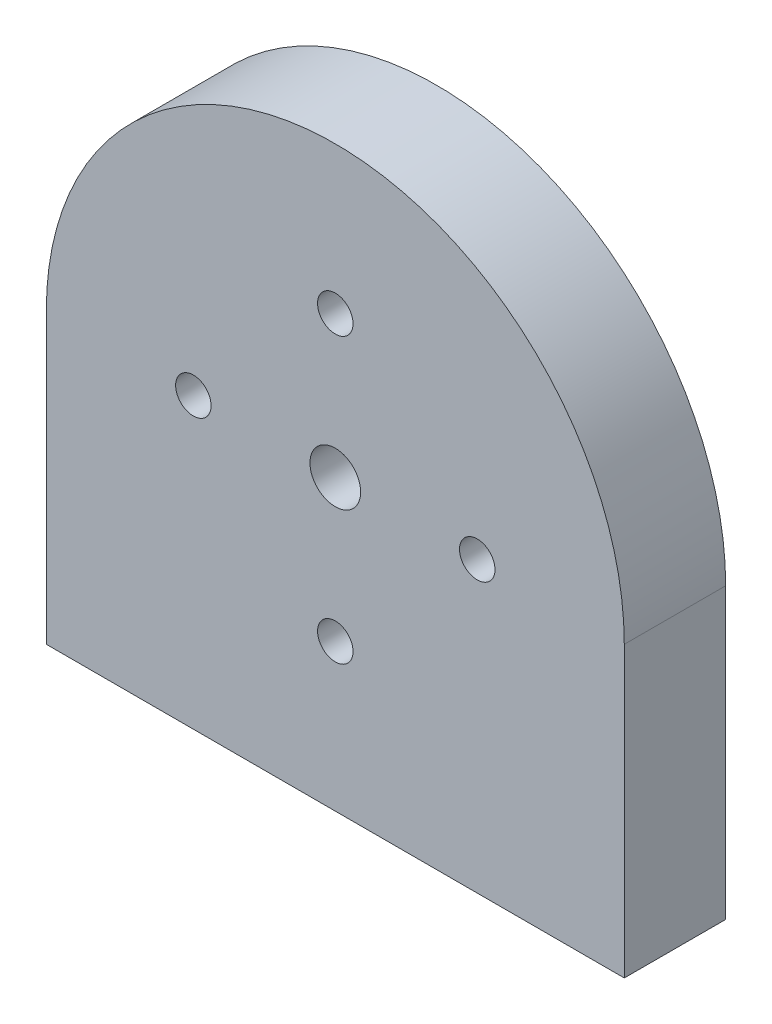
ISO-10303-21;
HEADER;
FILE_DESCRIPTION(('STEP AP214'),'2;1');
FILE_NAME('part.step','',(''),(''),'','','');
FILE_SCHEMA(('AUTOMOTIVE_DESIGN { 1 0 10303 214 1 1 1 1 }'));
ENDSEC;
DATA;
#1=APPLICATION_CONTEXT('core data for automotive mechanical design processes');
#2=APPLICATION_PROTOCOL_DEFINITION('international standard','automotive_design',2000,#1);
#3=PRODUCT_CONTEXT('',#1,'mechanical');
#4=PRODUCT('Part','Part','',(#3));
#5=PRODUCT_RELATED_PRODUCT_CATEGORY('part','',(#4));
#6=PRODUCT_DEFINITION_FORMATION('','',#4);
#7=PRODUCT_DEFINITION_CONTEXT('part definition',#1,'design');
#8=PRODUCT_DEFINITION('design','',#6,#7);
#9=PRODUCT_DEFINITION_SHAPE('','',#8);
#10=(LENGTH_UNIT() NAMED_UNIT(*) SI_UNIT(.MILLI.,.METRE.));
#11=(NAMED_UNIT(*) PLANE_ANGLE_UNIT() SI_UNIT($,.RADIAN.));
#12=(NAMED_UNIT(*) SI_UNIT($,.STERADIAN.) SOLID_ANGLE_UNIT());
#13=UNCERTAINTY_MEASURE_WITH_UNIT(LENGTH_MEASURE(1.E-05),#10,'distance_accuracy_value','');
#14=(GEOMETRIC_REPRESENTATION_CONTEXT(3) GLOBAL_UNCERTAINTY_ASSIGNED_CONTEXT((#13)) GLOBAL_UNIT_ASSIGNED_CONTEXT((#10,
#11,#12)) REPRESENTATION_CONTEXT('',''));
#15=CARTESIAN_POINT('',(0.,0.,0.));
#16=DIRECTION('',(0.,0.,1.));
#17=DIRECTION('',(1.,0.,0.));
#18=AXIS2_PLACEMENT_3D('',#15,#16,#17);
#19=CARTESIAN_POINT('',(0.,0.,10.));
#20=DIRECTION('',(0.,0.,1.));
#21=DIRECTION('',(1.,0.,0.));
#22=AXIS2_PLACEMENT_3D('',#19,#20,#21);
#23=PLANE('',#22);
#24=CARTESIAN_POINT('',(0.,-14.,10.));
#25=DIRECTION('',(0.,0.,1.));
#26=DIRECTION('',(1.,0.,0.));
#27=AXIS2_PLACEMENT_3D('',#24,#25,#26);
#28=CIRCLE('',#27,1.75000000000009);
#29=CARTESIAN_POINT('',(1.7500000000001,-14.,10.));
#30=VERTEX_POINT('',#29);
#31=EDGE_CURVE('E130',#30,#30,#28,.T.);
#32=ORIENTED_EDGE('',*,*,#31,.F.);
#33=EDGE_LOOP('',(#32));
#34=FACE_BOUND('',#33,.T.);
#35=CARTESIAN_POINT('',(0.,0.,10.));
#36=DIRECTION('',(0.,0.,1.));
#37=DIRECTION('',(1.,0.,0.));
#38=AXIS2_PLACEMENT_3D('',#35,#36,#37);
#39=CIRCLE('',#38,2.5);
#40=CARTESIAN_POINT('',(2.5,0.,10.));
#41=VERTEX_POINT('',#40);
#42=EDGE_CURVE('E118',#41,#41,#39,.T.);
#43=ORIENTED_EDGE('',*,*,#42,.F.);
#44=EDGE_LOOP('',(#43));
#45=FACE_BOUND('',#44,.T.);
#46=CARTESIAN_POINT('',(0.,0.,10.));
#47=DIRECTION('',(0.,0.,1.));
#48=DIRECTION('',(1.,0.,0.));
#49=AXIS2_PLACEMENT_3D('',#46,#47,#48);
#50=CIRCLE('',#49,28.5);
#51=CARTESIAN_POINT('',(28.5,0.,10.));
#52=VERTEX_POINT('',#51);
#53=CARTESIAN_POINT('',(-28.5,0.,10.));
#54=VERTEX_POINT('',#53);
#55=EDGE_CURVE('E88',#52,#54,#50,.T.);
#56=ORIENTED_EDGE('',*,*,#55,.T.);
#57=DIRECTION('',(0.,-1.,0.));
#58=VECTOR('',#57,1.);
#59=CARTESIAN_POINT('',(-28.5,0.,10.));
#60=LINE('',#59,#58);
#61=CARTESIAN_POINT('',(-28.5,-28.5,10.));
#62=VERTEX_POINT('',#61);
#63=EDGE_CURVE('E83',#54,#62,#60,.T.);
#64=ORIENTED_EDGE('',*,*,#63,.T.);
#65=DIRECTION('',(1.,0.,0.));
#66=VECTOR('',#65,1.);
#67=CARTESIAN_POINT('',(-28.5,-28.5,10.));
#68=LINE('',#67,#66);
#69=CARTESIAN_POINT('',(28.5,-28.5,10.));
#70=VERTEX_POINT('',#69);
#71=EDGE_CURVE('E86',#62,#70,#68,.T.);
#72=ORIENTED_EDGE('',*,*,#71,.T.);
#73=DIRECTION('',(0.,1.,0.));
#74=VECTOR('',#73,1.);
#75=CARTESIAN_POINT('',(28.5,-28.5,10.));
#76=LINE('',#75,#74);
#77=EDGE_CURVE('E53',#70,#52,#76,.T.);
#78=ORIENTED_EDGE('',*,*,#77,.T.);
#79=EDGE_LOOP('',(#56,#64,#72,#78));
#80=FACE_BOUND('',#79,.T.);
#81=CARTESIAN_POINT('',(0.,14.,10.));
#82=DIRECTION('',(0.,0.,1.));
#83=DIRECTION('',(1.,0.,0.));
#84=AXIS2_PLACEMENT_3D('',#81,#82,#83);
#85=CIRCLE('',#84,1.75);
#86=CARTESIAN_POINT('',(1.75,14.,10.));
#87=VERTEX_POINT('',#86);
#88=EDGE_CURVE('E103',#87,#87,#85,.T.);
#89=ORIENTED_EDGE('',*,*,#88,.F.);
#90=EDGE_LOOP('',(#89));
#91=FACE_BOUND('',#90,.T.);
#92=CARTESIAN_POINT('',(14.,0.,10.));
#93=DIRECTION('',(0.,0.,1.));
#94=DIRECTION('',(1.,0.,0.));
#95=AXIS2_PLACEMENT_3D('',#92,#93,#94);
#96=CIRCLE('',#95,1.75);
#97=CARTESIAN_POINT('',(15.75,0.,10.));
#98=VERTEX_POINT('',#97);
#99=EDGE_CURVE('E124',#98,#98,#96,.T.);
#100=ORIENTED_EDGE('',*,*,#99,.F.);
#101=EDGE_LOOP('',(#100));
#102=FACE_BOUND('',#101,.T.);
#103=CARTESIAN_POINT('',(-14.,0.,10.));
#104=DIRECTION('',(0.,0.,1.));
#105=DIRECTION('',(1.,0.,0.));
#106=AXIS2_PLACEMENT_3D('',#103,#104,#105);
#107=CIRCLE('',#106,1.75000000000014);
#108=CARTESIAN_POINT('',(-12.2499999999999,0.,10.));
#109=VERTEX_POINT('',#108);
#110=EDGE_CURVE('E136',#109,#109,#107,.T.);
#111=ORIENTED_EDGE('',*,*,#110,.F.);
#112=EDGE_LOOP('',(#111));
#113=FACE_BOUND('',#112,.T.);
#114=ADVANCED_FACE('F36',(#34,#45,#80,#91,#102,#113),#23,.T.);
#115=CARTESIAN_POINT('',(0.,0.,0.));
#116=DIRECTION('',(0.,0.,1.));
#117=DIRECTION('',(1.,0.,0.));
#118=AXIS2_PLACEMENT_3D('',#115,#116,#117);
#119=PLANE('',#118);
#120=CARTESIAN_POINT('',(0.,0.,0.));
#121=DIRECTION('',(0.,0.,1.));
#122=DIRECTION('',(1.,0.,0.));
#123=AXIS2_PLACEMENT_3D('',#120,#121,#122);
#124=CIRCLE('',#123,28.5);
#125=CARTESIAN_POINT('',(28.5,0.,0.));
#126=VERTEX_POINT('',#125);
#127=CARTESIAN_POINT('',(-28.5,0.,0.));
#128=VERTEX_POINT('',#127);
#129=EDGE_CURVE('E100',#126,#128,#124,.T.);
#130=ORIENTED_EDGE('',*,*,#129,.F.);
#131=DIRECTION('',(0.,1.,0.));
#132=VECTOR('',#131,1.);
#133=CARTESIAN_POINT('',(28.5,-28.5,0.));
#134=LINE('',#133,#132);
#135=CARTESIAN_POINT('',(28.5,-28.5,0.));
#136=VERTEX_POINT('',#135);
#137=EDGE_CURVE('E76',#136,#126,#134,.T.);
#138=ORIENTED_EDGE('',*,*,#137,.F.);
#139=DIRECTION('',(1.,0.,0.));
#140=VECTOR('',#139,1.);
#141=CARTESIAN_POINT('',(-28.5,-28.5,0.));
#142=LINE('',#141,#140);
#143=CARTESIAN_POINT('',(-28.5,-28.5,0.));
#144=VERTEX_POINT('',#143);
#145=EDGE_CURVE('E70',#144,#136,#142,.T.);
#146=ORIENTED_EDGE('',*,*,#145,.F.);
#147=DIRECTION('',(0.,-1.,0.));
#148=VECTOR('',#147,1.);
#149=CARTESIAN_POINT('',(-28.5,0.,0.));
#150=LINE('',#149,#148);
#151=EDGE_CURVE('E92',#128,#144,#150,.T.);
#152=ORIENTED_EDGE('',*,*,#151,.F.);
#153=EDGE_LOOP('',(#130,#138,#146,#152));
#154=FACE_BOUND('',#153,.T.);
#155=CARTESIAN_POINT('',(0.,14.,0.));
#156=DIRECTION('',(0.,0.,1.));
#157=DIRECTION('',(1.,0.,0.));
#158=AXIS2_PLACEMENT_3D('',#155,#156,#157);
#159=CIRCLE('',#158,1.75);
#160=CARTESIAN_POINT('',(1.75,14.,0.));
#161=VERTEX_POINT('',#160);
#162=EDGE_CURVE('E115',#161,#161,#159,.T.);
#163=ORIENTED_EDGE('',*,*,#162,.T.);
#164=EDGE_LOOP('',(#163));
#165=FACE_BOUND('',#164,.T.);
#166=CARTESIAN_POINT('',(0.,0.,0.));
#167=DIRECTION('',(0.,0.,1.));
#168=DIRECTION('',(1.,0.,0.));
#169=AXIS2_PLACEMENT_3D('',#166,#167,#168);
#170=CIRCLE('',#169,2.5);
#171=CARTESIAN_POINT('',(2.5,0.,0.));
#172=VERTEX_POINT('',#171);
#173=EDGE_CURVE('E121',#172,#172,#170,.T.);
#174=ORIENTED_EDGE('',*,*,#173,.T.);
#175=EDGE_LOOP('',(#174));
#176=FACE_BOUND('',#175,.T.);
#177=CARTESIAN_POINT('',(14.,0.,0.));
#178=DIRECTION('',(0.,0.,1.));
#179=DIRECTION('',(1.,0.,0.));
#180=AXIS2_PLACEMENT_3D('',#177,#178,#179);
#181=CIRCLE('',#180,1.75);
#182=CARTESIAN_POINT('',(15.75,0.,0.));
#183=VERTEX_POINT('',#182);
#184=EDGE_CURVE('E127',#183,#183,#181,.T.);
#185=ORIENTED_EDGE('',*,*,#184,.T.);
#186=EDGE_LOOP('',(#185));
#187=FACE_BOUND('',#186,.T.);
#188=CARTESIAN_POINT('',(0.,-14.,0.));
#189=DIRECTION('',(0.,0.,1.));
#190=DIRECTION('',(1.,0.,0.));
#191=AXIS2_PLACEMENT_3D('',#188,#189,#190);
#192=CIRCLE('',#191,1.75000000000009);
#193=CARTESIAN_POINT('',(1.7500000000001,-14.,0.));
#194=VERTEX_POINT('',#193);
#195=EDGE_CURVE('E133',#194,#194,#192,.T.);
#196=ORIENTED_EDGE('',*,*,#195,.T.);
#197=EDGE_LOOP('',(#196));
#198=FACE_BOUND('',#197,.T.);
#199=CARTESIAN_POINT('',(-14.,0.,0.));
#200=DIRECTION('',(0.,0.,1.));
#201=DIRECTION('',(1.,0.,0.));
#202=AXIS2_PLACEMENT_3D('',#199,#200,#201);
#203=CIRCLE('',#202,1.75000000000014);
#204=CARTESIAN_POINT('',(-12.2499999999999,0.,0.));
#205=VERTEX_POINT('',#204);
#206=EDGE_CURVE('E139',#205,#205,#203,.T.);
#207=ORIENTED_EDGE('',*,*,#206,.T.);
#208=EDGE_LOOP('',(#207));
#209=FACE_BOUND('',#208,.T.);
#210=ADVANCED_FACE('F111',(#154,#165,#176,#187,#198,#209),#119,.F.);
#211=CARTESIAN_POINT('',(0.,0.,10.));
#212=DIRECTION('',(0.,0.,-1.));
#213=DIRECTION('',(-1.,0.,0.));
#214=AXIS2_PLACEMENT_3D('',#211,#212,#213);
#215=CYLINDRICAL_SURFACE('',#214,28.5);
#216=ORIENTED_EDGE('',*,*,#129,.T.);
#217=DIRECTION('',(0.,0.,-1.));
#218=VECTOR('',#217,1.);
#219=CARTESIAN_POINT('',(-28.5,0.,10.));
#220=LINE('',#219,#218);
#221=EDGE_CURVE('E11',#54,#128,#220,.T.);
#222=ORIENTED_EDGE('',*,*,#221,.F.);
#223=ORIENTED_EDGE('',*,*,#55,.F.);
#224=DIRECTION('',(0.,0.,-1.));
#225=VECTOR('',#224,1.);
#226=CARTESIAN_POINT('',(28.5,0.,10.));
#227=LINE('',#226,#225);
#228=EDGE_CURVE('E96',#52,#126,#227,.T.);
#229=ORIENTED_EDGE('',*,*,#228,.T.);
#230=EDGE_LOOP('',(#216,#222,#223,#229));
#231=FACE_BOUND('',#230,.T.);
#232=ADVANCED_FACE('F38',(#231),#215,.T.);
#233=CARTESIAN_POINT('',(-28.5,0.,10.));
#234=DIRECTION('',(1.,0.,0.));
#235=DIRECTION('',(0.,1.,0.));
#236=AXIS2_PLACEMENT_3D('',#233,#234,#235);
#237=PLANE('',#236);
#238=ORIENTED_EDGE('',*,*,#151,.T.);
#239=DIRECTION('',(0.,0.,-1.));
#240=VECTOR('',#239,1.);
#241=CARTESIAN_POINT('',(-28.5,-28.5,10.));
#242=LINE('',#241,#240);
#243=EDGE_CURVE('E45',#62,#144,#242,.T.);
#244=ORIENTED_EDGE('',*,*,#243,.F.);
#245=ORIENTED_EDGE('',*,*,#63,.F.);
#246=ORIENTED_EDGE('',*,*,#221,.T.);
#247=EDGE_LOOP('',(#238,#244,#245,#246));
#248=FACE_BOUND('',#247,.T.);
#249=ADVANCED_FACE('F91',(#248),#237,.F.);
#250=CARTESIAN_POINT('',(-28.5,-28.5,10.));
#251=DIRECTION('',(0.,1.,0.));
#252=DIRECTION('',(0.,0.,1.));
#253=AXIS2_PLACEMENT_3D('',#250,#251,#252);
#254=PLANE('',#253);
#255=ORIENTED_EDGE('',*,*,#145,.T.);
#256=DIRECTION('',(0.,0.,-1.));
#257=VECTOR('',#256,1.);
#258=CARTESIAN_POINT('',(28.5,-28.5,10.));
#259=LINE('',#258,#257);
#260=EDGE_CURVE('E93',#70,#136,#259,.T.);
#261=ORIENTED_EDGE('',*,*,#260,.F.);
#262=ORIENTED_EDGE('',*,*,#71,.F.);
#263=ORIENTED_EDGE('',*,*,#243,.T.);
#264=EDGE_LOOP('',(#255,#261,#262,#263));
#265=FACE_BOUND('',#264,.T.);
#266=ADVANCED_FACE('F94',(#265),#254,.F.);
#267=CARTESIAN_POINT('',(28.5,-28.5,10.));
#268=DIRECTION('',(-1.,0.,0.));
#269=DIRECTION('',(0.,-1.,0.));
#270=AXIS2_PLACEMENT_3D('',#267,#268,#269);
#271=PLANE('',#270);
#272=ORIENTED_EDGE('',*,*,#137,.T.);
#273=ORIENTED_EDGE('',*,*,#228,.F.);
#274=ORIENTED_EDGE('',*,*,#77,.F.);
#275=ORIENTED_EDGE('',*,*,#260,.T.);
#276=EDGE_LOOP('',(#272,#273,#274,#275));
#277=FACE_BOUND('',#276,.T.);
#278=ADVANCED_FACE('F108',(#277),#271,.F.);
#279=CARTESIAN_POINT('',(0.,14.,10.));
#280=DIRECTION('',(0.,0.,-1.));
#281=DIRECTION('',(-1.,0.,0.));
#282=AXIS2_PLACEMENT_3D('',#279,#280,#281);
#283=CYLINDRICAL_SURFACE('',#282,1.75);
#284=ORIENTED_EDGE('',*,*,#88,.T.);
#285=EDGE_LOOP('',(#284));
#286=FACE_BOUND('',#285,.T.);
#287=ORIENTED_EDGE('',*,*,#162,.F.);
#288=EDGE_LOOP('',(#287));
#289=FACE_BOUND('',#288,.T.);
#290=ADVANCED_FACE('F158',(#286,#289),#283,.F.);
#291=CARTESIAN_POINT('',(0.,0.,10.));
#292=DIRECTION('',(0.,0.,-1.));
#293=DIRECTION('',(-1.,0.,0.));
#294=AXIS2_PLACEMENT_3D('',#291,#292,#293);
#295=CYLINDRICAL_SURFACE('',#294,2.5);
#296=ORIENTED_EDGE('',*,*,#42,.T.);
#297=EDGE_LOOP('',(#296));
#298=FACE_BOUND('',#297,.T.);
#299=ORIENTED_EDGE('',*,*,#173,.F.);
#300=EDGE_LOOP('',(#299));
#301=FACE_BOUND('',#300,.T.);
#302=ADVANCED_FACE('F204',(#298,#301),#295,.F.);
#303=CARTESIAN_POINT('',(14.,0.,10.));
#304=DIRECTION('',(0.,0.,-1.));
#305=DIRECTION('',(-1.,0.,0.));
#306=AXIS2_PLACEMENT_3D('',#303,#304,#305);
#307=CYLINDRICAL_SURFACE('',#306,1.75);
#308=ORIENTED_EDGE('',*,*,#99,.T.);
#309=EDGE_LOOP('',(#308));
#310=FACE_BOUND('',#309,.T.);
#311=ORIENTED_EDGE('',*,*,#184,.F.);
#312=EDGE_LOOP('',(#311));
#313=FACE_BOUND('',#312,.T.);
#314=ADVANCED_FACE('F212',(#310,#313),#307,.F.);
#315=CARTESIAN_POINT('',(0.,-14.,10.));
#316=DIRECTION('',(0.,0.,-1.));
#317=DIRECTION('',(-1.,0.,0.));
#318=AXIS2_PLACEMENT_3D('',#315,#316,#317);
#319=CYLINDRICAL_SURFACE('',#318,1.75000000000009);
#320=ORIENTED_EDGE('',*,*,#31,.T.);
#321=EDGE_LOOP('',(#320));
#322=FACE_BOUND('',#321,.T.);
#323=ORIENTED_EDGE('',*,*,#195,.F.);
#324=EDGE_LOOP('',(#323));
#325=FACE_BOUND('',#324,.T.);
#326=ADVANCED_FACE('F220',(#322,#325),#319,.F.);
#327=CARTESIAN_POINT('',(-14.,0.,10.));
#328=DIRECTION('',(0.,0.,-1.));
#329=DIRECTION('',(-1.,0.,0.));
#330=AXIS2_PLACEMENT_3D('',#327,#328,#329);
#331=CYLINDRICAL_SURFACE('',#330,1.75000000000014);
#332=ORIENTED_EDGE('',*,*,#110,.T.);
#333=EDGE_LOOP('',(#332));
#334=FACE_BOUND('',#333,.T.);
#335=ORIENTED_EDGE('',*,*,#206,.F.);
#336=EDGE_LOOP('',(#335));
#337=FACE_BOUND('',#336,.T.);
#338=ADVANCED_FACE('F145',(#334,#337),#331,.F.);
#339=CLOSED_SHELL('',(#114,#210,#232,#249,#266,#278,#290,#302,#314,#326,#338));
#340=MANIFOLD_SOLID_BREP('B2',#339);
#341=ADVANCED_BREP_SHAPE_REPRESENTATION('',(#18,#340),#14);
#342=SHAPE_DEFINITION_REPRESENTATION(#9,#341);
ENDSEC;
END-ISO-10303-21;
